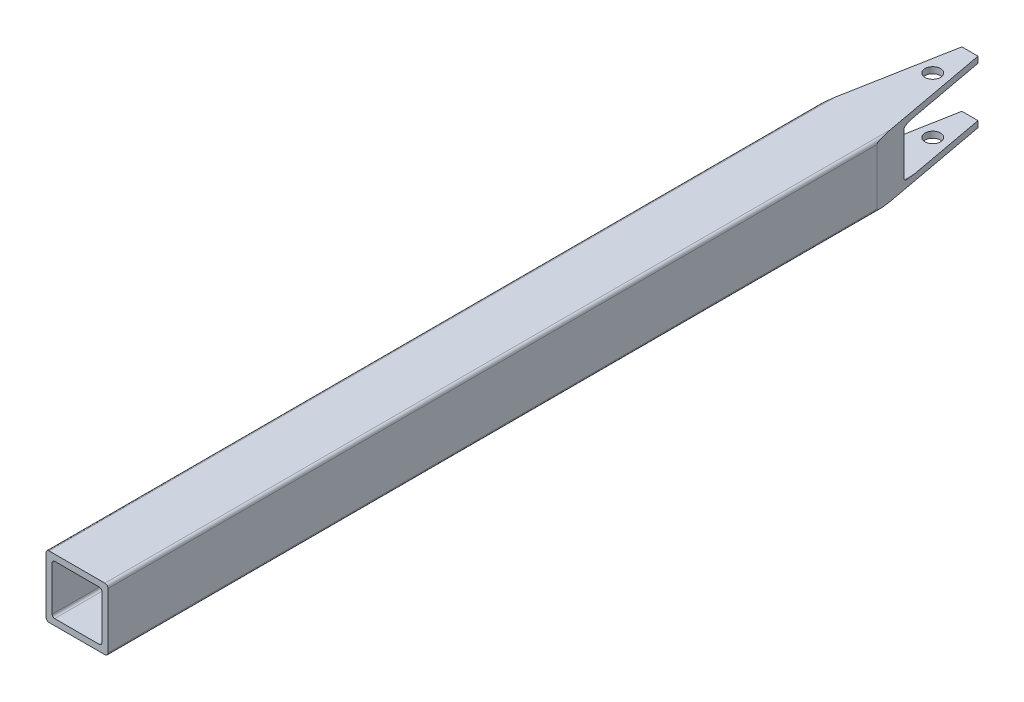
ISO-10303-21;
HEADER;
FILE_DESCRIPTION(('STEP AP214'),'2;1');
FILE_NAME('part.step','',(''),(''),'','','');
FILE_SCHEMA(('AUTOMOTIVE_DESIGN { 1 0 10303 214 1 1 1 1 }'));
ENDSEC;
DATA;
#1=APPLICATION_CONTEXT('core data for automotive mechanical design processes');
#2=APPLICATION_PROTOCOL_DEFINITION('international standard','automotive_design',2000,#1);
#3=PRODUCT_CONTEXT('',#1,'mechanical');
#4=PRODUCT('Part','Part','',(#3));
#5=PRODUCT_RELATED_PRODUCT_CATEGORY('part','',(#4));
#6=PRODUCT_DEFINITION_FORMATION('','',#4);
#7=PRODUCT_DEFINITION_CONTEXT('part definition',#1,'design');
#8=PRODUCT_DEFINITION('design','',#6,#7);
#9=PRODUCT_DEFINITION_SHAPE('','',#8);
#10=(LENGTH_UNIT() NAMED_UNIT(*) SI_UNIT(.MILLI.,.METRE.));
#11=(NAMED_UNIT(*) PLANE_ANGLE_UNIT() SI_UNIT($,.RADIAN.));
#12=(NAMED_UNIT(*) SI_UNIT($,.STERADIAN.) SOLID_ANGLE_UNIT());
#13=UNCERTAINTY_MEASURE_WITH_UNIT(LENGTH_MEASURE(1.E-05),#10,'distance_accuracy_value','');
#14=(GEOMETRIC_REPRESENTATION_CONTEXT(3) GLOBAL_UNCERTAINTY_ASSIGNED_CONTEXT((#13)) GLOBAL_UNIT_ASSIGNED_CONTEXT((#10,
#11,#12)) REPRESENTATION_CONTEXT('',''));
#15=CARTESIAN_POINT('',(0.,0.,0.));
#16=DIRECTION('',(0.,0.,1.));
#17=DIRECTION('',(1.,0.,0.));
#18=AXIS2_PLACEMENT_3D('',#15,#16,#17);
#19=CARTESIAN_POINT('',(28.575,-28.575,-457.2));
#20=DIRECTION('',(0.,0.,1.));
#21=DIRECTION('',(1.,0.,0.));
#22=AXIS2_PLACEMENT_3D('',#19,#20,#21);
#23=PLANE('',#22);
#24=DIRECTION('',(1.,0.,0.));
#25=VECTOR('',#24,1.);
#26=CARTESIAN_POINT('',(28.575,-31.75,-457.2));
#27=LINE('',#26,#25);
#28=CARTESIAN_POINT('',(-8.255,-31.75,-457.2));
#29=VERTEX_POINT('',#28);
#30=CARTESIAN_POINT('',(8.255,-31.75,-457.2));
#31=VERTEX_POINT('',#30);
#32=EDGE_CURVE('E210',#29,#31,#27,.T.);
#33=ORIENTED_EDGE('',*,*,#32,.F.);
#34=DIRECTION('',(0.,1.,0.));
#35=VECTOR('',#34,1.);
#36=CARTESIAN_POINT('',(-8.255,-31.75,-457.2));
#37=LINE('',#36,#35);
#38=CARTESIAN_POINT('',(-8.255,-25.4,-457.2));
#39=VERTEX_POINT('',#38);
#40=EDGE_CURVE('E191',#29,#39,#37,.T.);
#41=ORIENTED_EDGE('',*,*,#40,.T.);
#42=DIRECTION('',(1.,0.,0.));
#43=VECTOR('',#42,1.);
#44=CARTESIAN_POINT('',(22.86,-25.4,-457.2));
#45=LINE('',#44,#43);
#46=CARTESIAN_POINT('',(8.255,-25.4,-457.2));
#47=VERTEX_POINT('',#46);
#48=EDGE_CURVE('E226',#39,#47,#45,.T.);
#49=ORIENTED_EDGE('',*,*,#48,.T.);
#50=DIRECTION('',(0.,1.,0.));
#51=VECTOR('',#50,1.);
#52=CARTESIAN_POINT('',(8.255,-31.75,-457.2));
#53=LINE('',#52,#51);
#54=EDGE_CURVE('E216',#31,#47,#53,.T.);
#55=ORIENTED_EDGE('',*,*,#54,.F.);
#56=EDGE_LOOP('',(#33,#41,#49,#55));
#57=FACE_BOUND('',#56,.T.);
#58=ADVANCED_FACE('F43',(#57),#23,.F.);
#59=CARTESIAN_POINT('',(28.575,-28.575,457.2));
#60=DIRECTION('',(0.,0.,1.));
#61=DIRECTION('',(1.,0.,0.));
#62=AXIS2_PLACEMENT_3D('',#59,#60,#61);
#63=PLANE('',#62);
#64=CARTESIAN_POINT('',(28.575,-28.575,457.2));
#65=DIRECTION('',(0.,0.,1.));
#66=DIRECTION('',(1.,0.,0.));
#67=AXIS2_PLACEMENT_3D('',#64,#65,#66);
#68=CIRCLE('',#67,3.175);
#69=CARTESIAN_POINT('',(28.575,-31.75,457.2));
#70=VERTEX_POINT('',#69);
#71=CARTESIAN_POINT('',(31.75,-28.575,457.2));
#72=VERTEX_POINT('',#71);
#73=EDGE_CURVE('E270',#70,#72,#68,.T.);
#74=ORIENTED_EDGE('',*,*,#73,.T.);
#75=DIRECTION('',(0.,1.,0.));
#76=VECTOR('',#75,1.);
#77=CARTESIAN_POINT('',(31.75,-28.575,457.2));
#78=LINE('',#77,#76);
#79=CARTESIAN_POINT('',(31.75,28.575,457.2));
#80=VERTEX_POINT('',#79);
#81=EDGE_CURVE('E273',#72,#80,#78,.T.);
#82=ORIENTED_EDGE('',*,*,#81,.T.);
#83=CARTESIAN_POINT('',(28.575,28.575,457.2));
#84=DIRECTION('',(0.,0.,1.));
#85=DIRECTION('',(1.,0.,0.));
#86=AXIS2_PLACEMENT_3D('',#83,#84,#85);
#87=CIRCLE('',#86,3.175);
#88=CARTESIAN_POINT('',(28.575,31.75,457.2));
#89=VERTEX_POINT('',#88);
#90=EDGE_CURVE('E275',#80,#89,#87,.T.);
#91=ORIENTED_EDGE('',*,*,#90,.T.);
#92=DIRECTION('',(-1.,0.,0.));
#93=VECTOR('',#92,1.);
#94=CARTESIAN_POINT('',(28.575,31.75,457.2));
#95=LINE('',#94,#93);
#96=CARTESIAN_POINT('',(-28.575,31.75,457.2));
#97=VERTEX_POINT('',#96);
#98=EDGE_CURVE('E277',#89,#97,#95,.T.);
#99=ORIENTED_EDGE('',*,*,#98,.T.);
#100=CARTESIAN_POINT('',(-28.575,28.575,457.2));
#101=DIRECTION('',(0.,0.,1.));
#102=DIRECTION('',(1.,0.,0.));
#103=AXIS2_PLACEMENT_3D('',#100,#101,#102);
#104=CIRCLE('',#103,3.175);
#105=CARTESIAN_POINT('',(-31.75,28.575,457.2));
#106=VERTEX_POINT('',#105);
#107=EDGE_CURVE('E279',#97,#106,#104,.T.);
#108=ORIENTED_EDGE('',*,*,#107,.T.);
#109=DIRECTION('',(0.,-1.,0.));
#110=VECTOR('',#109,1.);
#111=CARTESIAN_POINT('',(-31.75,-28.575,457.2));
#112=LINE('',#111,#110);
#113=CARTESIAN_POINT('',(-31.75,-28.575,457.2));
#114=VERTEX_POINT('',#113);
#115=EDGE_CURVE('E281',#106,#114,#112,.T.);
#116=ORIENTED_EDGE('',*,*,#115,.T.);
#117=CARTESIAN_POINT('',(-28.575,-28.575,457.2));
#118=DIRECTION('',(0.,0.,1.));
#119=DIRECTION('',(1.,0.,0.));
#120=AXIS2_PLACEMENT_3D('',#117,#118,#119);
#121=CIRCLE('',#120,3.175);
#122=CARTESIAN_POINT('',(-28.575,-31.75,457.2));
#123=VERTEX_POINT('',#122);
#124=EDGE_CURVE('E283',#114,#123,#121,.T.);
#125=ORIENTED_EDGE('',*,*,#124,.T.);
#126=DIRECTION('',(1.,0.,0.));
#127=VECTOR('',#126,1.);
#128=CARTESIAN_POINT('',(28.575,-31.75,457.2));
#129=LINE('',#128,#127);
#130=EDGE_CURVE('E285',#123,#70,#129,.T.);
#131=ORIENTED_EDGE('',*,*,#130,.T.);
#132=EDGE_LOOP('',(#74,#82,#91,#99,#108,#116,#125,#131));
#133=FACE_BOUND('',#132,.T.);
#134=DIRECTION('',(-1.,0.,0.));
#135=VECTOR('',#134,1.);
#136=CARTESIAN_POINT('',(22.86,25.4,457.2));
#137=LINE('',#136,#135);
#138=CARTESIAN_POINT('',(22.86,25.4,457.2));
#139=VERTEX_POINT('',#138);
#140=CARTESIAN_POINT('',(-22.86,25.4,457.2));
#141=VERTEX_POINT('',#140);
#142=EDGE_CURVE('E222',#139,#141,#137,.T.);
#143=ORIENTED_EDGE('',*,*,#142,.F.);
#144=CARTESIAN_POINT('',(22.86,22.86,457.2));
#145=DIRECTION('',(0.,0.,1.));
#146=DIRECTION('',(1.,0.,0.));
#147=AXIS2_PLACEMENT_3D('',#144,#145,#146);
#148=CIRCLE('',#147,2.54);
#149=CARTESIAN_POINT('',(25.4,22.86,457.2));
#150=VERTEX_POINT('',#149);
#151=EDGE_CURVE('E218',#150,#139,#148,.T.);
#152=ORIENTED_EDGE('',*,*,#151,.F.);
#153=DIRECTION('',(0.,1.,0.));
#154=VECTOR('',#153,1.);
#155=CARTESIAN_POINT('',(25.4,22.86,457.2));
#156=LINE('',#155,#154);
#157=CARTESIAN_POINT('',(25.4,-22.86,457.2));
#158=VERTEX_POINT('',#157);
#159=EDGE_CURVE('E242',#158,#150,#156,.T.);
#160=ORIENTED_EDGE('',*,*,#159,.F.);
#161=CARTESIAN_POINT('',(22.86,-22.86,457.2));
#162=DIRECTION('',(0.,0.,1.));
#163=DIRECTION('',(1.,0.,0.));
#164=AXIS2_PLACEMENT_3D('',#161,#162,#163);
#165=CIRCLE('',#164,2.54);
#166=CARTESIAN_POINT('',(22.86,-25.4,457.2));
#167=VERTEX_POINT('',#166);
#168=EDGE_CURVE('E239',#167,#158,#165,.T.);
#169=ORIENTED_EDGE('',*,*,#168,.F.);
#170=DIRECTION('',(1.,0.,0.));
#171=VECTOR('',#170,1.);
#172=CARTESIAN_POINT('',(22.86,-25.4,457.2));
#173=LINE('',#172,#171);
#174=CARTESIAN_POINT('',(-22.86,-25.4,457.2));
#175=VERTEX_POINT('',#174);
#176=EDGE_CURVE('E237',#175,#167,#173,.T.);
#177=ORIENTED_EDGE('',*,*,#176,.F.);
#178=CARTESIAN_POINT('',(-22.86,-22.86,457.2));
#179=DIRECTION('',(0.,0.,1.));
#180=DIRECTION('',(1.,0.,0.));
#181=AXIS2_PLACEMENT_3D('',#178,#179,#180);
#182=CIRCLE('',#181,2.54);
#183=CARTESIAN_POINT('',(-25.4,-22.86,457.2));
#184=VERTEX_POINT('',#183);
#185=EDGE_CURVE('E235',#184,#175,#182,.T.);
#186=ORIENTED_EDGE('',*,*,#185,.F.);
#187=DIRECTION('',(0.,-1.,0.));
#188=VECTOR('',#187,1.);
#189=CARTESIAN_POINT('',(-25.4,22.86,457.2));
#190=LINE('',#189,#188);
#191=CARTESIAN_POINT('',(-25.4,22.86,457.2));
#192=VERTEX_POINT('',#191);
#193=EDGE_CURVE('E233',#192,#184,#190,.T.);
#194=ORIENTED_EDGE('',*,*,#193,.F.);
#195=CARTESIAN_POINT('',(-22.86,22.86,457.2));
#196=DIRECTION('',(0.,0.,1.));
#197=DIRECTION('',(1.,0.,0.));
#198=AXIS2_PLACEMENT_3D('',#195,#196,#197);
#199=CIRCLE('',#198,2.54);
#200=EDGE_CURVE('E231',#141,#192,#199,.T.);
#201=ORIENTED_EDGE('',*,*,#200,.F.);
#202=EDGE_LOOP('',(#143,#152,#160,#169,#177,#186,#194,#201));
#203=FACE_BOUND('',#202,.T.);
#204=ADVANCED_FACE('F403',(#133,#203),#63,.T.);
#205=CARTESIAN_POINT('',(28.575,-28.575,457.2));
#206=DIRECTION('',(0.,0.,-1.));
#207=DIRECTION('',(-1.,0.,0.));
#208=AXIS2_PLACEMENT_3D('',#205,#206,#207);
#209=CYLINDRICAL_SURFACE('',#208,3.175);
#210=DIRECTION('',(0.,0.,-1.));
#211=VECTOR('',#210,1.);
#212=CARTESIAN_POINT('',(28.575,-31.75,457.2));
#213=LINE('',#212,#211);
#214=CARTESIAN_POINT('',(28.575,-31.75,-347.362162162162));
#215=VERTEX_POINT('',#214);
#216=EDGE_CURVE('E287',#70,#215,#213,.T.);
#217=ORIENTED_EDGE('',*,*,#216,.T.);
#218=CARTESIAN_POINT('',(28.575,-28.575,-347.362162162162));
#219=DIRECTION('',(-0.98331459249179,0.,0.181913199610981));
#220=DIRECTION('',(-0.181913199610981,0.,-0.98331459249179));
#221=AXIS2_PLACEMENT_3D('',#218,#219,#220);
#222=ELLIPSE('',#221,17.4533789015294,3.175);
#223=CARTESIAN_POINT('',(31.75,-28.575,-330.2));
#224=VERTEX_POINT('',#223);
#225=EDGE_CURVE('E353',#215,#224,#222,.T.);
#226=ORIENTED_EDGE('',*,*,#225,.T.);
#227=DIRECTION('',(0.,0.,-1.));
#228=VECTOR('',#227,1.);
#229=CARTESIAN_POINT('',(31.75,-28.575,457.2));
#230=LINE('',#229,#228);
#231=EDGE_CURVE('E307',#72,#224,#230,.T.);
#232=ORIENTED_EDGE('',*,*,#231,.F.);
#233=ORIENTED_EDGE('',*,*,#73,.F.);
#234=EDGE_LOOP('',(#217,#226,#232,#233));
#235=FACE_BOUND('',#234,.T.);
#236=ADVANCED_FACE('F45',(#235),#209,.T.);
#237=CARTESIAN_POINT('',(31.75,-28.575,457.2));
#238=DIRECTION('',(-1.,0.,0.));
#239=DIRECTION('',(0.,0.,1.));
#240=AXIS2_PLACEMENT_3D('',#237,#238,#239);
#241=PLANE('',#240);
#242=ORIENTED_EDGE('',*,*,#231,.T.);
#243=DIRECTION('',(0.,1.,0.));
#244=VECTOR('',#243,1.);
#245=CARTESIAN_POINT('',(31.75,-31.75,-330.2));
#246=LINE('',#245,#244);
#247=CARTESIAN_POINT('',(31.75,28.575,-330.2));
#248=VERTEX_POINT('',#247);
#249=EDGE_CURVE('E382',#224,#248,#246,.T.);
#250=ORIENTED_EDGE('',*,*,#249,.T.);
#251=DIRECTION('',(0.,0.,-1.));
#252=VECTOR('',#251,1.);
#253=CARTESIAN_POINT('',(31.75,28.575,457.2));
#254=LINE('',#253,#252);
#255=EDGE_CURVE('E304',#80,#248,#254,.T.);
#256=ORIENTED_EDGE('',*,*,#255,.F.);
#257=ORIENTED_EDGE('',*,*,#81,.F.);
#258=EDGE_LOOP('',(#242,#250,#256,#257));
#259=FACE_BOUND('',#258,.T.);
#260=ADVANCED_FACE('F415',(#259),#241,.F.);
#261=CARTESIAN_POINT('',(28.575,28.575,457.2));
#262=DIRECTION('',(0.,0.,-1.));
#263=DIRECTION('',(-1.,0.,0.));
#264=AXIS2_PLACEMENT_3D('',#261,#262,#263);
#265=CYLINDRICAL_SURFACE('',#264,3.175);
#266=ORIENTED_EDGE('',*,*,#255,.T.);
#267=CARTESIAN_POINT('',(28.575,28.575,-347.362162162162));
#268=DIRECTION('',(-0.98331459249179,0.,0.181913199610981));
#269=DIRECTION('',(-0.181913199610981,0.,-0.98331459249179));
#270=AXIS2_PLACEMENT_3D('',#267,#268,#269);
#271=ELLIPSE('',#270,17.4533789015294,3.175);
#272=CARTESIAN_POINT('',(28.575,31.75,-347.362162162162));
#273=VERTEX_POINT('',#272);
#274=EDGE_CURVE('E357',#248,#273,#271,.T.);
#275=ORIENTED_EDGE('',*,*,#274,.T.);
#276=DIRECTION('',(0.,0.,-1.));
#277=VECTOR('',#276,1.);
#278=CARTESIAN_POINT('',(28.575,31.75,457.2));
#279=LINE('',#278,#277);
#280=EDGE_CURVE('E301',#89,#273,#279,.T.);
#281=ORIENTED_EDGE('',*,*,#280,.F.);
#282=ORIENTED_EDGE('',*,*,#90,.F.);
#283=EDGE_LOOP('',(#266,#275,#281,#282));
#284=FACE_BOUND('',#283,.T.);
#285=ADVANCED_FACE('F412',(#284),#265,.T.);
#286=CARTESIAN_POINT('',(28.575,31.75,457.2));
#287=DIRECTION('',(0.,-1.,0.));
#288=DIRECTION('',(0.,0.,-1.));
#289=AXIS2_PLACEMENT_3D('',#286,#287,#288);
#290=PLANE('',#289);
#291=CARTESIAN_POINT('',(0.,31.75,-419.1));
#292=DIRECTION('',(0.,1.,0.));
#293=DIRECTION('',(0.,0.,1.));
#294=AXIS2_PLACEMENT_3D('',#291,#292,#293);
#295=CIRCLE('',#294,7.9375);
#296=CARTESIAN_POINT('',(0.,31.75,-411.1625));
#297=VERTEX_POINT('',#296);
#298=EDGE_CURVE('E372',#297,#297,#295,.T.);
#299=ORIENTED_EDGE('',*,*,#298,.F.);
#300=EDGE_LOOP('',(#299));
#301=FACE_BOUND('',#300,.T.);
#302=DIRECTION('',(-1.,0.,0.));
#303=VECTOR('',#302,1.);
#304=CARTESIAN_POINT('',(28.575,31.75,-457.2));
#305=LINE('',#304,#303);
#306=CARTESIAN_POINT('',(8.255,31.75,-457.2));
#307=VERTEX_POINT('',#306);
#308=CARTESIAN_POINT('',(-8.255,31.75,-457.2));
#309=VERTEX_POINT('',#308);
#310=EDGE_CURVE('E219',#307,#309,#305,.T.);
#311=ORIENTED_EDGE('',*,*,#310,.T.);
#312=DIRECTION('',(0.181913199610981,0.,-0.98331459249179));
#313=VECTOR('',#312,1.);
#314=CARTESIAN_POINT('',(-8.255,31.75,-457.2));
#315=LINE('',#314,#313);
#316=CARTESIAN_POINT('',(-28.575,31.75,-347.362162162162));
#317=VERTEX_POINT('',#316);
#318=EDGE_CURVE('E62',#317,#309,#315,.T.);
#319=ORIENTED_EDGE('',*,*,#318,.F.);
#320=DIRECTION('',(0.,0.,-1.));
#321=VECTOR('',#320,1.);
#322=CARTESIAN_POINT('',(-28.575,31.75,457.2));
#323=LINE('',#322,#321);
#324=EDGE_CURVE('E298',#97,#317,#323,.T.);
#325=ORIENTED_EDGE('',*,*,#324,.F.);
#326=ORIENTED_EDGE('',*,*,#98,.F.);
#327=ORIENTED_EDGE('',*,*,#280,.T.);
#328=DIRECTION('',(0.181913199610981,0.,0.98331459249179));
#329=VECTOR('',#328,1.);
#330=CARTESIAN_POINT('',(8.255,31.75,-457.2));
#331=LINE('',#330,#329);
#332=EDGE_CURVE('E379',#307,#273,#331,.T.);
#333=ORIENTED_EDGE('',*,*,#332,.F.);
#334=EDGE_LOOP('',(#311,#319,#325,#326,#327,#333));
#335=FACE_BOUND('',#334,.T.);
#336=ADVANCED_FACE('F409',(#301,#335),#290,.F.);
#337=CARTESIAN_POINT('',(-28.575,28.575,457.2));
#338=DIRECTION('',(0.,0.,-1.));
#339=DIRECTION('',(-1.,0.,0.));
#340=AXIS2_PLACEMENT_3D('',#337,#338,#339);
#341=CYLINDRICAL_SURFACE('',#340,3.175);
#342=ORIENTED_EDGE('',*,*,#324,.T.);
#343=CARTESIAN_POINT('',(-28.575,28.575,-347.362162162162));
#344=DIRECTION('',(0.98331459249179,0.,0.181913199610981));
#345=DIRECTION('',(0.181913199610981,0.,-0.98331459249179));
#346=AXIS2_PLACEMENT_3D('',#343,#344,#345);
#347=ELLIPSE('',#346,17.4533789015294,3.175);
#348=CARTESIAN_POINT('',(-31.75,28.575,-330.2));
#349=VERTEX_POINT('',#348);
#350=EDGE_CURVE('E339',#317,#349,#347,.T.);
#351=ORIENTED_EDGE('',*,*,#350,.T.);
#352=DIRECTION('',(0.,0.,-1.));
#353=VECTOR('',#352,1.);
#354=CARTESIAN_POINT('',(-31.75,28.575,457.2));
#355=LINE('',#354,#353);
#356=EDGE_CURVE('E295',#106,#349,#355,.T.);
#357=ORIENTED_EDGE('',*,*,#356,.F.);
#358=ORIENTED_EDGE('',*,*,#107,.F.);
#359=EDGE_LOOP('',(#342,#351,#357,#358));
#360=FACE_BOUND('',#359,.T.);
#361=ADVANCED_FACE('F396',(#360),#341,.T.);
#362=CARTESIAN_POINT('',(-31.75,-28.575,457.2));
#363=DIRECTION('',(1.,0.,0.));
#364=DIRECTION('',(0.,0.,-1.));
#365=AXIS2_PLACEMENT_3D('',#362,#363,#364);
#366=PLANE('',#365);
#367=ORIENTED_EDGE('',*,*,#356,.T.);
#368=DIRECTION('',(0.,1.,0.));
#369=VECTOR('',#368,1.);
#370=CARTESIAN_POINT('',(-31.75,-31.75,-330.2));
#371=LINE('',#370,#369);
#372=CARTESIAN_POINT('',(-31.75,-28.575,-330.2));
#373=VERTEX_POINT('',#372);
#374=EDGE_CURVE('E204',#373,#349,#371,.T.);
#375=ORIENTED_EDGE('',*,*,#374,.F.);
#376=DIRECTION('',(0.,0.,-1.));
#377=VECTOR('',#376,1.);
#378=CARTESIAN_POINT('',(-31.75,-28.575,457.2));
#379=LINE('',#378,#377);
#380=EDGE_CURVE('E292',#114,#373,#379,.T.);
#381=ORIENTED_EDGE('',*,*,#380,.F.);
#382=ORIENTED_EDGE('',*,*,#115,.F.);
#383=EDGE_LOOP('',(#367,#375,#381,#382));
#384=FACE_BOUND('',#383,.T.);
#385=ADVANCED_FACE('F400',(#384),#366,.F.);
#386=CARTESIAN_POINT('',(-28.575,-28.575,457.2));
#387=DIRECTION('',(0.,0.,-1.));
#388=DIRECTION('',(-1.,0.,0.));
#389=AXIS2_PLACEMENT_3D('',#386,#387,#388);
#390=CYLINDRICAL_SURFACE('',#389,3.175);
#391=ORIENTED_EDGE('',*,*,#380,.T.);
#392=CARTESIAN_POINT('',(-28.575,-28.575,-347.362162162162));
#393=DIRECTION('',(0.98331459249179,0.,0.181913199610981));
#394=DIRECTION('',(0.181913199610981,0.,-0.98331459249179));
#395=AXIS2_PLACEMENT_3D('',#392,#393,#394);
#396=ELLIPSE('',#395,17.4533789015294,3.175);
#397=CARTESIAN_POINT('',(-28.575,-31.75,-347.362162162162));
#398=VERTEX_POINT('',#397);
#399=EDGE_CURVE('E342',#373,#398,#396,.T.);
#400=ORIENTED_EDGE('',*,*,#399,.T.);
#401=DIRECTION('',(0.,0.,-1.));
#402=VECTOR('',#401,1.);
#403=CARTESIAN_POINT('',(-28.575,-31.75,457.2));
#404=LINE('',#403,#402);
#405=EDGE_CURVE('E213',#123,#398,#404,.T.);
#406=ORIENTED_EDGE('',*,*,#405,.F.);
#407=ORIENTED_EDGE('',*,*,#124,.F.);
#408=EDGE_LOOP('',(#391,#400,#406,#407));
#409=FACE_BOUND('',#408,.T.);
#410=ADVANCED_FACE('F474',(#409),#390,.T.);
#411=CARTESIAN_POINT('',(28.575,-31.75,457.2));
#412=DIRECTION('',(0.,1.,0.));
#413=DIRECTION('',(0.,0.,1.));
#414=AXIS2_PLACEMENT_3D('',#411,#412,#413);
#415=PLANE('',#414);
#416=CARTESIAN_POINT('',(0.,-31.75,-419.1));
#417=DIRECTION('',(0.,1.,0.));
#418=DIRECTION('',(0.,0.,1.));
#419=AXIS2_PLACEMENT_3D('',#416,#417,#418);
#420=CIRCLE('',#419,7.9375);
#421=CARTESIAN_POINT('',(0.,-31.75,-411.1625));
#422=VERTEX_POINT('',#421);
#423=EDGE_CURVE('E375',#422,#422,#420,.T.);
#424=ORIENTED_EDGE('',*,*,#423,.T.);
#425=EDGE_LOOP('',(#424));
#426=FACE_BOUND('',#425,.T.);
#427=ORIENTED_EDGE('',*,*,#405,.T.);
#428=DIRECTION('',(0.181913199610981,0.,-0.98331459249179));
#429=VECTOR('',#428,1.);
#430=CARTESIAN_POINT('',(-8.255,-31.75,-457.2));
#431=LINE('',#430,#429);
#432=EDGE_CURVE('E194',#398,#29,#431,.T.);
#433=ORIENTED_EDGE('',*,*,#432,.T.);
#434=ORIENTED_EDGE('',*,*,#32,.T.);
#435=DIRECTION('',(0.181913199610981,0.,0.98331459249179));
#436=VECTOR('',#435,1.);
#437=CARTESIAN_POINT('',(8.255,-31.75,-457.2));
#438=LINE('',#437,#436);
#439=EDGE_CURVE('E72',#31,#215,#438,.T.);
#440=ORIENTED_EDGE('',*,*,#439,.T.);
#441=ORIENTED_EDGE('',*,*,#216,.F.);
#442=ORIENTED_EDGE('',*,*,#130,.F.);
#443=EDGE_LOOP('',(#427,#433,#434,#440,#441,#442));
#444=FACE_BOUND('',#443,.T.);
#445=ADVANCED_FACE('F209',(#426,#444),#415,.F.);
#446=CARTESIAN_POINT('',(22.86,22.86,457.2));
#447=DIRECTION('',(0.,0.,-1.));
#448=DIRECTION('',(-1.,0.,0.));
#449=AXIS2_PLACEMENT_3D('',#446,#447,#448);
#450=CYLINDRICAL_SURFACE('',#449,2.54);
#451=CARTESIAN_POINT('',(22.86,22.86,-378.254054054054));
#452=DIRECTION('',(-0.98331459249179,0.,0.181913199610981));
#453=DIRECTION('',(-0.181913199610981,0.,-0.98331459249179));
#454=AXIS2_PLACEMENT_3D('',#451,#452,#453);
#455=ELLIPSE('',#454,13.9627031212235,2.54);
#456=CARTESIAN_POINT('',(25.4,22.86,-364.524324324324));
#457=VERTEX_POINT('',#456);
#458=CARTESIAN_POINT('',(22.86,25.4,-378.254054054054));
#459=VERTEX_POINT('',#458);
#460=EDGE_CURVE('E362',#457,#459,#455,.T.);
#461=ORIENTED_EDGE('',*,*,#460,.F.);
#462=DIRECTION('',(0.,0.,-1.));
#463=VECTOR('',#462,1.);
#464=CARTESIAN_POINT('',(25.4,22.86,457.2));
#465=LINE('',#464,#463);
#466=EDGE_CURVE('E244',#150,#457,#465,.T.);
#467=ORIENTED_EDGE('',*,*,#466,.F.);
#468=ORIENTED_EDGE('',*,*,#151,.T.);
#469=DIRECTION('',(0.,0.,-1.));
#470=VECTOR('',#469,1.);
#471=CARTESIAN_POINT('',(22.86,25.4,457.2));
#472=LINE('',#471,#470);
#473=EDGE_CURVE('E267',#139,#459,#472,.T.);
#474=ORIENTED_EDGE('',*,*,#473,.T.);
#475=EDGE_LOOP('',(#461,#467,#468,#474));
#476=FACE_BOUND('',#475,.T.);
#477=ADVANCED_FACE('F468',(#476),#450,.F.);
#478=CARTESIAN_POINT('',(22.86,25.4,457.2));
#479=DIRECTION('',(0.,-1.,0.));
#480=DIRECTION('',(1.,0.,0.));
#481=AXIS2_PLACEMENT_3D('',#478,#479,#480);
#482=PLANE('',#481);
#483=DIRECTION('',(-0.181913199610981,0.,0.98331459249179));
#484=VECTOR('',#483,1.);
#485=CARTESIAN_POINT('',(-170.791284778457,25.4000000000001,421.374512315985));
#486=LINE('',#485,#484);
#487=CARTESIAN_POINT('',(-8.255,25.4,-457.2));
#488=VERTEX_POINT('',#487);
#489=CARTESIAN_POINT('',(-22.86,25.4,-378.254054054054));
#490=VERTEX_POINT('',#489);
#491=EDGE_CURVE('E328',#488,#490,#486,.T.);
#492=ORIENTED_EDGE('',*,*,#491,.F.);
#493=DIRECTION('',(-1.,0.,0.));
#494=VECTOR('',#493,1.);
#495=CARTESIAN_POINT('',(22.86,25.4,-457.2));
#496=LINE('',#495,#494);
#497=CARTESIAN_POINT('',(8.255,25.4,-457.2));
#498=VERTEX_POINT('',#497);
#499=EDGE_CURVE('E319',#498,#488,#496,.T.);
#500=ORIENTED_EDGE('',*,*,#499,.F.);
#501=DIRECTION('',(-0.181913199610981,0.,-0.98331459249179));
#502=VECTOR('',#501,1.);
#503=CARTESIAN_POINT('',(172.304269863908,25.3999999999999,429.552810075177));
#504=LINE('',#503,#502);
#505=EDGE_CURVE('E327',#459,#498,#504,.T.);
#506=ORIENTED_EDGE('',*,*,#505,.F.);
#507=ORIENTED_EDGE('',*,*,#473,.F.);
#508=ORIENTED_EDGE('',*,*,#142,.T.);
#509=DIRECTION('',(0.,0.,-1.));
#510=VECTOR('',#509,1.);
#511=CARTESIAN_POINT('',(-22.86,25.4,457.2));
#512=LINE('',#511,#510);
#513=EDGE_CURVE('E264',#141,#490,#512,.T.);
#514=ORIENTED_EDGE('',*,*,#513,.T.);
#515=EDGE_LOOP('',(#492,#500,#506,#507,#508,#514));
#516=FACE_BOUND('',#515,.T.);
#517=CARTESIAN_POINT('',(0.,25.4,-419.1));
#518=DIRECTION('',(0.,-1.,0.));
#519=DIRECTION('',(1.,0.,0.));
#520=AXIS2_PLACEMENT_3D('',#517,#518,#519);
#521=CIRCLE('',#520,7.9375);
#522=CARTESIAN_POINT('',(7.9375,25.4,-419.1));
#523=VERTEX_POINT('',#522);
#524=EDGE_CURVE('E330',#523,#523,#521,.T.);
#525=ORIENTED_EDGE('',*,*,#524,.F.);
#526=EDGE_LOOP('',(#525));
#527=FACE_BOUND('',#526,.T.);
#528=ADVANCED_FACE('F324',(#516,#527),#482,.T.);
#529=CARTESIAN_POINT('',(-22.86,22.86,457.2));
#530=DIRECTION('',(0.,0.,-1.));
#531=DIRECTION('',(-1.,0.,0.));
#532=AXIS2_PLACEMENT_3D('',#529,#530,#531);
#533=CYLINDRICAL_SURFACE('',#532,2.54);
#534=CARTESIAN_POINT('',(-22.86,22.86,-378.254054054054));
#535=DIRECTION('',(0.98331459249179,0.,0.181913199610981));
#536=DIRECTION('',(0.181913199610981,0.,-0.98331459249179));
#537=AXIS2_PLACEMENT_3D('',#534,#535,#536);
#538=ELLIPSE('',#537,13.9627031212235,2.54);
#539=CARTESIAN_POINT('',(-25.4,22.86,-364.524324324324));
#540=VERTEX_POINT('',#539);
#541=EDGE_CURVE('E345',#490,#540,#538,.T.);
#542=ORIENTED_EDGE('',*,*,#541,.F.);
#543=ORIENTED_EDGE('',*,*,#513,.F.);
#544=ORIENTED_EDGE('',*,*,#200,.T.);
#545=DIRECTION('',(0.,0.,-1.));
#546=VECTOR('',#545,1.);
#547=CARTESIAN_POINT('',(-25.4,22.86,457.2));
#548=LINE('',#547,#546);
#549=EDGE_CURVE('E261',#192,#540,#548,.T.);
#550=ORIENTED_EDGE('',*,*,#549,.T.);
#551=EDGE_LOOP('',(#542,#543,#544,#550));
#552=FACE_BOUND('',#551,.T.);
#553=ADVANCED_FACE('F461',(#552),#533,.F.);
#554=CARTESIAN_POINT('',(-25.4,22.86,457.2));
#555=DIRECTION('',(1.,0.,0.));
#556=DIRECTION('',(0.,0.,-1.));
#557=AXIS2_PLACEMENT_3D('',#554,#555,#556);
#558=PLANE('',#557);
#559=DIRECTION('',(0.,-1.,0.));
#560=VECTOR('',#559,1.);
#561=CARTESIAN_POINT('',(-25.4,22.86,-364.524324324324));
#562=LINE('',#561,#560);
#563=CARTESIAN_POINT('',(-25.4,-22.86,-364.524324324324));
#564=VERTEX_POINT('',#563);
#565=EDGE_CURVE('E347',#540,#564,#562,.T.);
#566=ORIENTED_EDGE('',*,*,#565,.F.);
#567=ORIENTED_EDGE('',*,*,#549,.F.);
#568=ORIENTED_EDGE('',*,*,#193,.T.);
#569=DIRECTION('',(0.,0.,-1.));
#570=VECTOR('',#569,1.);
#571=CARTESIAN_POINT('',(-25.4,-22.86,457.2));
#572=LINE('',#571,#570);
#573=EDGE_CURVE('E258',#184,#564,#572,.T.);
#574=ORIENTED_EDGE('',*,*,#573,.T.);
#575=EDGE_LOOP('',(#566,#567,#568,#574));
#576=FACE_BOUND('',#575,.T.);
#577=ADVANCED_FACE('F457',(#576),#558,.T.);
#578=CARTESIAN_POINT('',(-22.86,-22.86,457.2));
#579=DIRECTION('',(0.,0.,-1.));
#580=DIRECTION('',(-1.,0.,0.));
#581=AXIS2_PLACEMENT_3D('',#578,#579,#580);
#582=CYLINDRICAL_SURFACE('',#581,2.54);
#583=CARTESIAN_POINT('',(-22.86,-22.86,-378.254054054054));
#584=DIRECTION('',(0.98331459249179,0.,0.181913199610981));
#585=DIRECTION('',(0.181913199610981,0.,-0.98331459249179));
#586=AXIS2_PLACEMENT_3D('',#583,#584,#585);
#587=ELLIPSE('',#586,13.9627031212235,2.54);
#588=CARTESIAN_POINT('',(-22.86,-25.4,-378.254054054054));
#589=VERTEX_POINT('',#588);
#590=EDGE_CURVE('E349',#564,#589,#587,.T.);
#591=ORIENTED_EDGE('',*,*,#590,.F.);
#592=ORIENTED_EDGE('',*,*,#573,.F.);
#593=ORIENTED_EDGE('',*,*,#185,.T.);
#594=DIRECTION('',(0.,0.,-1.));
#595=VECTOR('',#594,1.);
#596=CARTESIAN_POINT('',(-22.86,-25.4,457.2));
#597=LINE('',#596,#595);
#598=EDGE_CURVE('E255',#175,#589,#597,.T.);
#599=ORIENTED_EDGE('',*,*,#598,.T.);
#600=EDGE_LOOP('',(#591,#592,#593,#599));
#601=FACE_BOUND('',#600,.T.);
#602=ADVANCED_FACE('F453',(#601),#582,.F.);
#603=CARTESIAN_POINT('',(22.86,-25.4,457.2));
#604=DIRECTION('',(0.,1.,0.));
#605=DIRECTION('',(-1.,0.,0.));
#606=AXIS2_PLACEMENT_3D('',#603,#604,#605);
#607=PLANE('',#606);
#608=DIRECTION('',(0.181913199610981,0.,-0.98331459249179));
#609=VECTOR('',#608,1.);
#610=CARTESIAN_POINT('',(-170.791284778457,-25.4,421.374512315985));
#611=LINE('',#610,#609);
#612=EDGE_CURVE('E197',#589,#39,#611,.T.);
#613=ORIENTED_EDGE('',*,*,#612,.F.);
#614=ORIENTED_EDGE('',*,*,#598,.F.);
#615=ORIENTED_EDGE('',*,*,#176,.T.);
#616=DIRECTION('',(0.,0.,-1.));
#617=VECTOR('',#616,1.);
#618=CARTESIAN_POINT('',(22.86,-25.4,457.2));
#619=LINE('',#618,#617);
#620=CARTESIAN_POINT('',(22.86,-25.4,-378.254054054054));
#621=VERTEX_POINT('',#620);
#622=EDGE_CURVE('E251',#167,#621,#619,.T.);
#623=ORIENTED_EDGE('',*,*,#622,.T.);
#624=DIRECTION('',(0.181913199610981,0.,0.98331459249179));
#625=VECTOR('',#624,1.);
#626=CARTESIAN_POINT('',(172.304269863908,-25.4,429.552810075177));
#627=LINE('',#626,#625);
#628=EDGE_CURVE('E364',#47,#621,#627,.T.);
#629=ORIENTED_EDGE('',*,*,#628,.F.);
#630=ORIENTED_EDGE('',*,*,#48,.F.);
#631=EDGE_LOOP('',(#613,#614,#615,#623,#629,#630));
#632=FACE_BOUND('',#631,.T.);
#633=CARTESIAN_POINT('',(0.,-25.4,-419.1));
#634=DIRECTION('',(0.,1.,0.));
#635=DIRECTION('',(-1.,0.,0.));
#636=AXIS2_PLACEMENT_3D('',#633,#634,#635);
#637=CIRCLE('',#636,7.9375);
#638=CARTESIAN_POINT('',(-7.93749999999999,-25.4,-419.1));
#639=VERTEX_POINT('',#638);
#640=EDGE_CURVE('E47',#639,#639,#637,.T.);
#641=ORIENTED_EDGE('',*,*,#640,.F.);
#642=EDGE_LOOP('',(#641));
#643=FACE_BOUND('',#642,.T.);
#644=ADVANCED_FACE('F446',(#632,#643),#607,.T.);
#645=CARTESIAN_POINT('',(22.86,-22.86,457.2));
#646=DIRECTION('',(0.,0.,-1.));
#647=DIRECTION('',(-1.,0.,0.));
#648=AXIS2_PLACEMENT_3D('',#645,#646,#647);
#649=CYLINDRICAL_SURFACE('',#648,2.54);
#650=CARTESIAN_POINT('',(22.86,-22.86,-378.254054054054));
#651=DIRECTION('',(-0.98331459249179,0.,0.181913199610981));
#652=DIRECTION('',(-0.181913199610981,0.,-0.98331459249179));
#653=AXIS2_PLACEMENT_3D('',#650,#651,#652);
#654=ELLIPSE('',#653,13.9627031212235,2.54);
#655=CARTESIAN_POINT('',(25.4,-22.86,-364.524324324324));
#656=VERTEX_POINT('',#655);
#657=EDGE_CURVE('E367',#621,#656,#654,.T.);
#658=ORIENTED_EDGE('',*,*,#657,.F.);
#659=ORIENTED_EDGE('',*,*,#622,.F.);
#660=ORIENTED_EDGE('',*,*,#168,.T.);
#661=DIRECTION('',(0.,0.,-1.));
#662=VECTOR('',#661,1.);
#663=CARTESIAN_POINT('',(25.4,-22.86,457.2));
#664=LINE('',#663,#662);
#665=EDGE_CURVE('E247',#158,#656,#664,.T.);
#666=ORIENTED_EDGE('',*,*,#665,.T.);
#667=EDGE_LOOP('',(#658,#659,#660,#666));
#668=FACE_BOUND('',#667,.T.);
#669=ADVANCED_FACE('F441',(#668),#649,.F.);
#670=CARTESIAN_POINT('',(25.4,22.86,457.2));
#671=DIRECTION('',(-1.,0.,0.));
#672=DIRECTION('',(0.,-1.,0.));
#673=AXIS2_PLACEMENT_3D('',#670,#671,#672);
#674=PLANE('',#673);
#675=DIRECTION('',(0.,1.,0.));
#676=VECTOR('',#675,1.);
#677=CARTESIAN_POINT('',(25.4,22.8599999999993,-364.524324324324));
#678=LINE('',#677,#676);
#679=EDGE_CURVE('E203',#656,#457,#678,.T.);
#680=ORIENTED_EDGE('',*,*,#679,.F.);
#681=ORIENTED_EDGE('',*,*,#665,.F.);
#682=ORIENTED_EDGE('',*,*,#159,.T.);
#683=ORIENTED_EDGE('',*,*,#466,.T.);
#684=EDGE_LOOP('',(#680,#681,#682,#683));
#685=FACE_BOUND('',#684,.T.);
#686=ADVANCED_FACE('F434',(#685),#674,.T.);
#687=ORIENTED_EDGE('',*,*,#499,.T.);
#688=DIRECTION('',(0.,1.,0.));
#689=VECTOR('',#688,1.);
#690=CARTESIAN_POINT('',(-8.255,-28.575,-457.2));
#691=LINE('',#690,#689);
#692=EDGE_CURVE('E11',#488,#309,#691,.T.);
#693=ORIENTED_EDGE('',*,*,#692,.T.);
#694=ORIENTED_EDGE('',*,*,#310,.F.);
#695=DIRECTION('',(0.,-1.,0.));
#696=VECTOR('',#695,1.);
#697=CARTESIAN_POINT('',(8.255,-28.575,-457.2));
#698=LINE('',#697,#696);
#699=EDGE_CURVE('E53',#307,#498,#698,.T.);
#700=ORIENTED_EDGE('',*,*,#699,.T.);
#701=EDGE_LOOP('',(#687,#693,#694,#700));
#702=FACE_BOUND('',#701,.T.);
#703=ADVANCED_FACE('F318',(#702),#23,.F.);
#704=CARTESIAN_POINT('',(8.255,-31.75,-457.2));
#705=DIRECTION('',(-0.98331459249179,0.,0.181913199610981));
#706=DIRECTION('',(0.181913199610981,0.,0.98331459249179));
#707=AXIS2_PLACEMENT_3D('',#704,#705,#706);
#708=PLANE('',#707);
#709=ORIENTED_EDGE('',*,*,#439,.F.);
#710=ORIENTED_EDGE('',*,*,#54,.T.);
#711=ORIENTED_EDGE('',*,*,#628,.T.);
#712=ORIENTED_EDGE('',*,*,#657,.T.);
#713=ORIENTED_EDGE('',*,*,#679,.T.);
#714=ORIENTED_EDGE('',*,*,#460,.T.);
#715=ORIENTED_EDGE('',*,*,#505,.T.);
#716=ORIENTED_EDGE('',*,*,#699,.F.);
#717=ORIENTED_EDGE('',*,*,#332,.T.);
#718=ORIENTED_EDGE('',*,*,#274,.F.);
#719=ORIENTED_EDGE('',*,*,#249,.F.);
#720=ORIENTED_EDGE('',*,*,#225,.F.);
#721=EDGE_LOOP('',(#709,#710,#711,#712,#713,#714,#715,#716,#717,#718,#719,#720));
#722=FACE_BOUND('',#721,.T.);
#723=ADVANCED_FACE('F410',(#722),#708,.F.);
#724=CARTESIAN_POINT('',(-8.255,-31.75,-457.2));
#725=DIRECTION('',(0.98331459249179,0.,0.181913199610981));
#726=DIRECTION('',(0.181913199610981,0.,-0.98331459249179));
#727=AXIS2_PLACEMENT_3D('',#724,#725,#726);
#728=PLANE('',#727);
#729=ORIENTED_EDGE('',*,*,#318,.T.);
#730=ORIENTED_EDGE('',*,*,#692,.F.);
#731=ORIENTED_EDGE('',*,*,#491,.T.);
#732=ORIENTED_EDGE('',*,*,#541,.T.);
#733=ORIENTED_EDGE('',*,*,#565,.T.);
#734=ORIENTED_EDGE('',*,*,#590,.T.);
#735=ORIENTED_EDGE('',*,*,#612,.T.);
#736=ORIENTED_EDGE('',*,*,#40,.F.);
#737=ORIENTED_EDGE('',*,*,#432,.F.);
#738=ORIENTED_EDGE('',*,*,#399,.F.);
#739=ORIENTED_EDGE('',*,*,#374,.T.);
#740=ORIENTED_EDGE('',*,*,#350,.F.);
#741=EDGE_LOOP('',(#729,#730,#731,#732,#733,#734,#735,#736,#737,#738,#739,#740));
#742=FACE_BOUND('',#741,.T.);
#743=ADVANCED_FACE('F193',(#742),#728,.F.);
#744=CARTESIAN_POINT('',(0.,-31.75,-419.1));
#745=DIRECTION('',(0.,1.,0.));
#746=DIRECTION('',(0.,0.,1.));
#747=AXIS2_PLACEMENT_3D('',#744,#745,#746);
#748=CYLINDRICAL_SURFACE('',#747,7.9375);
#749=ORIENTED_EDGE('',*,*,#640,.T.);
#750=EDGE_LOOP('',(#749));
#751=FACE_BOUND('',#750,.T.);
#752=ORIENTED_EDGE('',*,*,#423,.F.);
#753=EDGE_LOOP('',(#752));
#754=FACE_BOUND('',#753,.T.);
#755=ADVANCED_FACE('F568',(#751,#754),#748,.F.);
#756=ORIENTED_EDGE('',*,*,#524,.T.);
#757=EDGE_LOOP('',(#756));
#758=FACE_BOUND('',#757,.T.);
#759=ORIENTED_EDGE('',*,*,#298,.T.);
#760=EDGE_LOOP('',(#759));
#761=FACE_BOUND('',#760,.T.);
#762=ADVANCED_FACE('F573',(#758,#761),#748,.F.);
#763=CLOSED_SHELL('',(#58,#204,#236,#260,#285,#336,#361,#385,#410,#445,#477,#528,#553,#577,#602,
#644,#669,#686,#703,#723,#743,#755,#762));
#764=MANIFOLD_SOLID_BREP('B2',#763);
#765=ADVANCED_BREP_SHAPE_REPRESENTATION('',(#18,#764),#14);
#766=SHAPE_DEFINITION_REPRESENTATION(#9,#765);
ENDSEC;
END-ISO-10303-21;
